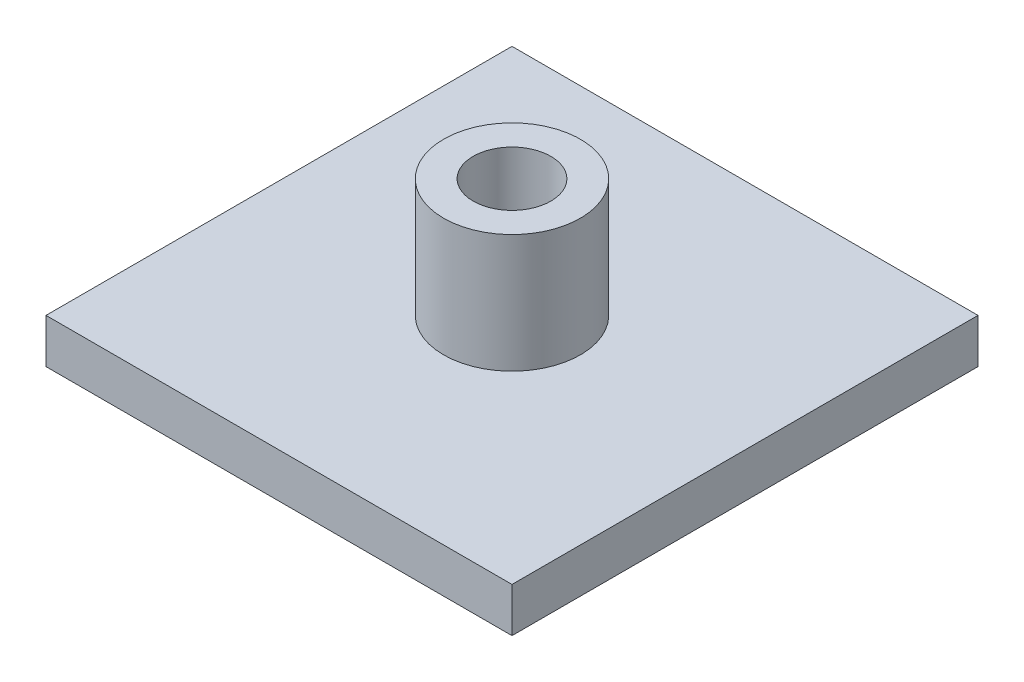
ISO-10303-21;
HEADER;
FILE_DESCRIPTION(('STEP AP214'),'2;1');
FILE_NAME('part.step','',(''),(''),'','','');
FILE_SCHEMA(('AUTOMOTIVE_DESIGN { 1 0 10303 214 1 1 1 1 }'));
ENDSEC;
DATA;
#1=APPLICATION_CONTEXT('core data for automotive mechanical design processes');
#2=APPLICATION_PROTOCOL_DEFINITION('international standard','automotive_design',2000,#1);
#3=PRODUCT_CONTEXT('',#1,'mechanical');
#4=PRODUCT('Part','Part','',(#3));
#5=PRODUCT_RELATED_PRODUCT_CATEGORY('part','',(#4));
#6=PRODUCT_DEFINITION_FORMATION('','',#4);
#7=PRODUCT_DEFINITION_CONTEXT('part definition',#1,'design');
#8=PRODUCT_DEFINITION('design','',#6,#7);
#9=PRODUCT_DEFINITION_SHAPE('','',#8);
#10=(LENGTH_UNIT() NAMED_UNIT(*) SI_UNIT(.MILLI.,.METRE.));
#11=(NAMED_UNIT(*) PLANE_ANGLE_UNIT() SI_UNIT($,.RADIAN.));
#12=(NAMED_UNIT(*) SI_UNIT($,.STERADIAN.) SOLID_ANGLE_UNIT());
#13=UNCERTAINTY_MEASURE_WITH_UNIT(LENGTH_MEASURE(1.E-05),#10,'distance_accuracy_value','');
#14=(GEOMETRIC_REPRESENTATION_CONTEXT(3) GLOBAL_UNCERTAINTY_ASSIGNED_CONTEXT((#13)) GLOBAL_UNIT_ASSIGNED_CONTEXT((#10,
#11,#12)) REPRESENTATION_CONTEXT('',''));
#15=CARTESIAN_POINT('',(0.,0.,0.));
#16=DIRECTION('',(0.,0.,1.));
#17=DIRECTION('',(1.,0.,0.));
#18=AXIS2_PLACEMENT_3D('',#15,#16,#17);
#19=CARTESIAN_POINT('',(0.,3.,0.));
#20=DIRECTION('',(1.,0.,0.));
#21=DIRECTION('',(0.,0.,-1.));
#22=AXIS2_PLACEMENT_3D('',#19,#20,#21);
#23=PLANE('',#22);
#24=DIRECTION('',(0.,0.,1.));
#25=VECTOR('',#24,1.);
#26=CARTESIAN_POINT('',(0.,0.,0.));
#27=LINE('',#26,#25);
#28=CARTESIAN_POINT('',(0.,0.,-31.5));
#29=VERTEX_POINT('',#28);
#30=CARTESIAN_POINT('',(0.,0.,0.));
#31=VERTEX_POINT('',#30);
#32=EDGE_CURVE('E114',#29,#31,#27,.T.);
#33=ORIENTED_EDGE('',*,*,#32,.T.);
#34=DIRECTION('',(0.,-1.,0.));
#35=VECTOR('',#34,1.);
#36=CARTESIAN_POINT('',(0.,3.,0.));
#37=LINE('',#36,#35);
#38=CARTESIAN_POINT('',(0.,3.,0.));
#39=VERTEX_POINT('',#38);
#40=EDGE_CURVE('E46',#39,#31,#37,.T.);
#41=ORIENTED_EDGE('',*,*,#40,.F.);
#42=DIRECTION('',(0.,0.,1.));
#43=VECTOR('',#42,1.);
#44=CARTESIAN_POINT('',(0.,3.,0.));
#45=LINE('',#44,#43);
#46=CARTESIAN_POINT('',(0.,3.,-31.5));
#47=VERTEX_POINT('',#46);
#48=EDGE_CURVE('E97',#47,#39,#45,.T.);
#49=ORIENTED_EDGE('',*,*,#48,.F.);
#50=DIRECTION('',(0.,-1.,0.));
#51=VECTOR('',#50,1.);
#52=CARTESIAN_POINT('',(0.,3.,-31.5));
#53=LINE('',#52,#51);
#54=EDGE_CURVE('E110',#47,#29,#53,.T.);
#55=ORIENTED_EDGE('',*,*,#54,.T.);
#56=EDGE_LOOP('',(#33,#41,#49,#55));
#57=FACE_BOUND('',#56,.T.);
#58=ADVANCED_FACE('F43',(#57),#23,.F.);
#59=CARTESIAN_POINT('',(0.,3.,0.));
#60=DIRECTION('',(0.,0.,-1.));
#61=DIRECTION('',(-1.,0.,0.));
#62=AXIS2_PLACEMENT_3D('',#59,#60,#61);
#63=PLANE('',#62);
#64=DIRECTION('',(1.,0.,0.));
#65=VECTOR('',#64,1.);
#66=CARTESIAN_POINT('',(0.,0.,0.));
#67=LINE('',#66,#65);
#68=CARTESIAN_POINT('',(31.5,0.,0.));
#69=VERTEX_POINT('',#68);
#70=EDGE_CURVE('E103',#31,#69,#67,.T.);
#71=ORIENTED_EDGE('',*,*,#70,.T.);
#72=DIRECTION('',(0.,-1.,0.));
#73=VECTOR('',#72,1.);
#74=CARTESIAN_POINT('',(31.5,3.,0.));
#75=LINE('',#74,#73);
#76=CARTESIAN_POINT('',(31.5,3.,0.));
#77=VERTEX_POINT('',#76);
#78=EDGE_CURVE('E101',#77,#69,#75,.T.);
#79=ORIENTED_EDGE('',*,*,#78,.F.);
#80=DIRECTION('',(1.,0.,0.));
#81=VECTOR('',#80,1.);
#82=CARTESIAN_POINT('',(0.,3.,0.));
#83=LINE('',#82,#81);
#84=EDGE_CURVE('E92',#39,#77,#83,.T.);
#85=ORIENTED_EDGE('',*,*,#84,.F.);
#86=ORIENTED_EDGE('',*,*,#40,.T.);
#87=EDGE_LOOP('',(#71,#79,#85,#86));
#88=FACE_BOUND('',#87,.T.);
#89=ADVANCED_FACE('F102',(#88),#63,.F.);
#90=CARTESIAN_POINT('',(31.5,3.,0.));
#91=DIRECTION('',(-1.,0.,0.));
#92=DIRECTION('',(0.,0.,1.));
#93=AXIS2_PLACEMENT_3D('',#90,#91,#92);
#94=PLANE('',#93);
#95=DIRECTION('',(0.,0.,-1.));
#96=VECTOR('',#95,1.);
#97=CARTESIAN_POINT('',(31.5,0.,0.));
#98=LINE('',#97,#96);
#99=CARTESIAN_POINT('',(31.5,0.,-31.5));
#100=VERTEX_POINT('',#99);
#101=EDGE_CURVE('E78',#69,#100,#98,.T.);
#102=ORIENTED_EDGE('',*,*,#101,.T.);
#103=DIRECTION('',(0.,-1.,0.));
#104=VECTOR('',#103,1.);
#105=CARTESIAN_POINT('',(31.5,3.,-31.5));
#106=LINE('',#105,#104);
#107=CARTESIAN_POINT('',(31.5,3.,-31.5));
#108=VERTEX_POINT('',#107);
#109=EDGE_CURVE('E105',#108,#100,#106,.T.);
#110=ORIENTED_EDGE('',*,*,#109,.F.);
#111=DIRECTION('',(0.,0.,-1.));
#112=VECTOR('',#111,1.);
#113=CARTESIAN_POINT('',(31.5,3.,0.));
#114=LINE('',#113,#112);
#115=EDGE_CURVE('E95',#77,#108,#114,.T.);
#116=ORIENTED_EDGE('',*,*,#115,.F.);
#117=ORIENTED_EDGE('',*,*,#78,.T.);
#118=EDGE_LOOP('',(#102,#110,#116,#117));
#119=FACE_BOUND('',#118,.T.);
#120=ADVANCED_FACE('F106',(#119),#94,.F.);
#121=CARTESIAN_POINT('',(0.,3.,-31.5));
#122=DIRECTION('',(0.,0.,1.));
#123=DIRECTION('',(1.,0.,0.));
#124=AXIS2_PLACEMENT_3D('',#121,#122,#123);
#125=PLANE('',#124);
#126=DIRECTION('',(-1.,0.,0.));
#127=VECTOR('',#126,1.);
#128=CARTESIAN_POINT('',(0.,0.,-31.5));
#129=LINE('',#128,#127);
#130=EDGE_CURVE('E84',#100,#29,#129,.T.);
#131=ORIENTED_EDGE('',*,*,#130,.T.);
#132=ORIENTED_EDGE('',*,*,#54,.F.);
#133=DIRECTION('',(-1.,0.,0.));
#134=VECTOR('',#133,1.);
#135=CARTESIAN_POINT('',(0.,3.,-31.5));
#136=LINE('',#135,#134);
#137=EDGE_CURVE('E61',#108,#47,#136,.T.);
#138=ORIENTED_EDGE('',*,*,#137,.F.);
#139=ORIENTED_EDGE('',*,*,#109,.T.);
#140=EDGE_LOOP('',(#131,#132,#138,#139));
#141=FACE_BOUND('',#140,.T.);
#142=ADVANCED_FACE('F128',(#141),#125,.F.);
#143=CARTESIAN_POINT('',(0.,3.,0.));
#144=DIRECTION('',(0.,-1.,0.));
#145=DIRECTION('',(0.,0.,-1.));
#146=AXIS2_PLACEMENT_3D('',#143,#144,#145);
#147=PLANE('',#146);
#148=CARTESIAN_POINT('',(15.75,3.,-15.75));
#149=DIRECTION('',(0.,1.,0.));
#150=DIRECTION('',(0.,0.,1.));
#151=AXIS2_PLACEMENT_3D('',#148,#149,#150);
#152=CIRCLE('',#151,4.625);
#153=CARTESIAN_POINT('',(15.75,3.,-11.125));
#154=VERTEX_POINT('',#153);
#155=EDGE_CURVE('E11',#154,#154,#152,.T.);
#156=ORIENTED_EDGE('',*,*,#155,.F.);
#157=EDGE_LOOP('',(#156));
#158=FACE_BOUND('',#157,.T.);
#159=ORIENTED_EDGE('',*,*,#48,.T.);
#160=ORIENTED_EDGE('',*,*,#84,.T.);
#161=ORIENTED_EDGE('',*,*,#115,.T.);
#162=ORIENTED_EDGE('',*,*,#137,.T.);
#163=EDGE_LOOP('',(#159,#160,#161,#162));
#164=FACE_BOUND('',#163,.T.);
#165=ADVANCED_FACE('F93',(#158,#164),#147,.F.);
#166=CARTESIAN_POINT('',(0.,0.,0.));
#167=DIRECTION('',(0.,-1.,0.));
#168=DIRECTION('',(0.,0.,-1.));
#169=AXIS2_PLACEMENT_3D('',#166,#167,#168);
#170=PLANE('',#169);
#171=ORIENTED_EDGE('',*,*,#32,.F.);
#172=ORIENTED_EDGE('',*,*,#130,.F.);
#173=ORIENTED_EDGE('',*,*,#101,.F.);
#174=ORIENTED_EDGE('',*,*,#70,.F.);
#175=EDGE_LOOP('',(#171,#172,#173,#174));
#176=FACE_BOUND('',#175,.T.);
#177=ADVANCED_FACE('F131',(#176),#170,.T.);
#178=CARTESIAN_POINT('',(15.75,11.,-15.75));
#179=DIRECTION('',(0.,1.,0.));
#180=DIRECTION('',(0.,0.,1.));
#181=AXIS2_PLACEMENT_3D('',#178,#179,#180);
#182=PLANE('',#181);
#183=CARTESIAN_POINT('',(15.75,11.,-15.75));
#184=DIRECTION('',(0.,1.,0.));
#185=DIRECTION('',(0.,0.,1.));
#186=AXIS2_PLACEMENT_3D('',#183,#184,#185);
#187=CIRCLE('',#186,4.625);
#188=CARTESIAN_POINT('',(15.75,11.,-11.125));
#189=VERTEX_POINT('',#188);
#190=EDGE_CURVE('E118',#189,#189,#187,.T.);
#191=ORIENTED_EDGE('',*,*,#190,.T.);
#192=EDGE_LOOP('',(#191));
#193=FACE_BOUND('',#192,.T.);
#194=CARTESIAN_POINT('',(15.75,11.,-15.75));
#195=DIRECTION('',(0.,1.,0.));
#196=DIRECTION('',(0.,0.,1.));
#197=AXIS2_PLACEMENT_3D('',#194,#195,#196);
#198=CIRCLE('',#197,2.625);
#199=CARTESIAN_POINT('',(15.75,11.,-13.125));
#200=VERTEX_POINT('',#199);
#201=EDGE_CURVE('E138',#200,#200,#198,.T.);
#202=ORIENTED_EDGE('',*,*,#201,.F.);
#203=EDGE_LOOP('',(#202));
#204=FACE_BOUND('',#203,.T.);
#205=ADVANCED_FACE('F150',(#193,#204),#182,.T.);
#206=CARTESIAN_POINT('',(15.75,11.,-15.75));
#207=DIRECTION('',(0.,-1.,0.));
#208=DIRECTION('',(0.,0.,-1.));
#209=AXIS2_PLACEMENT_3D('',#206,#207,#208);
#210=CYLINDRICAL_SURFACE('',#209,4.625);
#211=ORIENTED_EDGE('',*,*,#190,.F.);
#212=EDGE_LOOP('',(#211));
#213=FACE_BOUND('',#212,.T.);
#214=ORIENTED_EDGE('',*,*,#155,.T.);
#215=EDGE_LOOP('',(#214));
#216=FACE_BOUND('',#215,.T.);
#217=ADVANCED_FACE('F152',(#213,#216),#210,.T.);
#218=CARTESIAN_POINT('',(15.75,11.,-15.75));
#219=DIRECTION('',(0.,-1.,0.));
#220=DIRECTION('',(0.,0.,-1.));
#221=AXIS2_PLACEMENT_3D('',#218,#219,#220);
#222=CYLINDRICAL_SURFACE('',#221,2.625);
#223=ORIENTED_EDGE('',*,*,#201,.T.);
#224=EDGE_LOOP('',(#223));
#225=FACE_BOUND('',#224,.T.);
#226=CARTESIAN_POINT('',(15.75,3.,-15.75));
#227=DIRECTION('',(0.,1.,0.));
#228=DIRECTION('',(0.,0.,1.));
#229=AXIS2_PLACEMENT_3D('',#226,#227,#228);
#230=CIRCLE('',#229,2.625);
#231=CARTESIAN_POINT('',(15.75,3.,-13.125));
#232=VERTEX_POINT('',#231);
#233=EDGE_CURVE('E139',#232,#232,#230,.T.);
#234=ORIENTED_EDGE('',*,*,#233,.F.);
#235=EDGE_LOOP('',(#234));
#236=FACE_BOUND('',#235,.T.);
#237=ADVANCED_FACE('F147',(#225,#236),#222,.F.);
#238=ORIENTED_EDGE('',*,*,#233,.T.);
#239=EDGE_LOOP('',(#238));
#240=FACE_BOUND('',#239,.T.);
#241=ADVANCED_FACE('F177',(#240),#147,.F.);
#242=CLOSED_SHELL('',(#58,#89,#120,#142,#165,#177,#205,#217,#237,#241));
#243=MANIFOLD_SOLID_BREP('B2',#242);
#244=ADVANCED_BREP_SHAPE_REPRESENTATION('',(#18,#243),#14);
#245=SHAPE_DEFINITION_REPRESENTATION(#9,#244);
ENDSEC;
END-ISO-10303-21;
